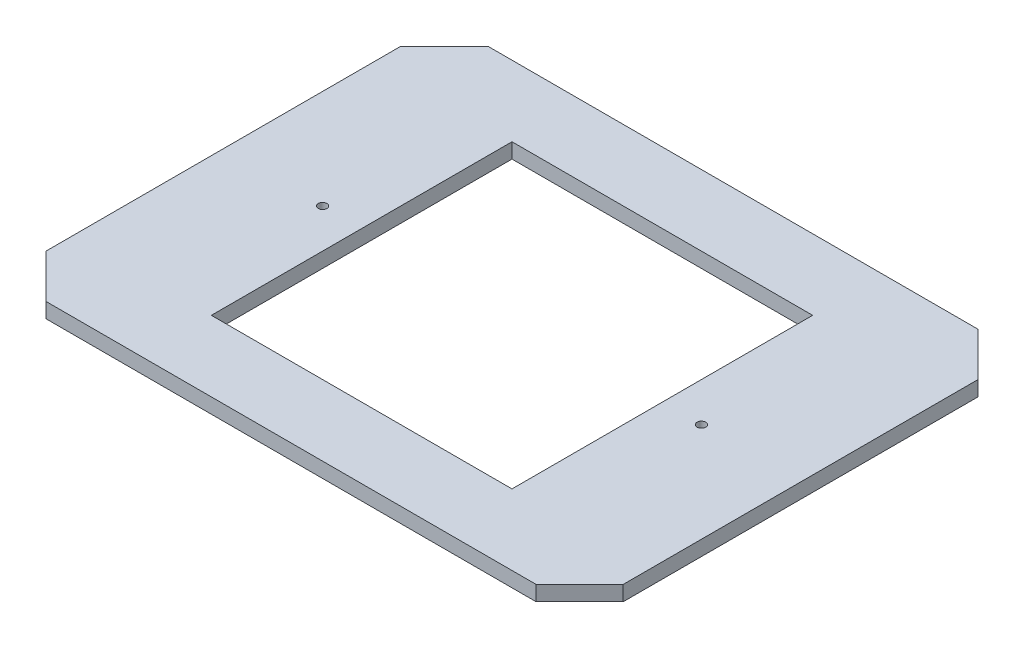
ISO-10303-21;
HEADER;
FILE_DESCRIPTION(('STEP AP214'),'2;1');
FILE_NAME('part.step','',(''),(''),'','','');
FILE_SCHEMA(('AUTOMOTIVE_DESIGN { 1 0 10303 214 1 1 1 1 }'));
ENDSEC;
DATA;
#1=APPLICATION_CONTEXT('core data for automotive mechanical design processes');
#2=APPLICATION_PROTOCOL_DEFINITION('international standard','automotive_design',2000,#1);
#3=PRODUCT_CONTEXT('',#1,'mechanical');
#4=PRODUCT('Part','Part','',(#3));
#5=PRODUCT_RELATED_PRODUCT_CATEGORY('part','',(#4));
#6=PRODUCT_DEFINITION_FORMATION('','',#4);
#7=PRODUCT_DEFINITION_CONTEXT('part definition',#1,'design');
#8=PRODUCT_DEFINITION('design','',#6,#7);
#9=PRODUCT_DEFINITION_SHAPE('','',#8);
#10=(LENGTH_UNIT() NAMED_UNIT(*) SI_UNIT(.MILLI.,.METRE.));
#11=(NAMED_UNIT(*) PLANE_ANGLE_UNIT() SI_UNIT($,.RADIAN.));
#12=(NAMED_UNIT(*) SI_UNIT($,.STERADIAN.) SOLID_ANGLE_UNIT());
#13=UNCERTAINTY_MEASURE_WITH_UNIT(LENGTH_MEASURE(1.E-05),#10,'distance_accuracy_value','');
#14=(GEOMETRIC_REPRESENTATION_CONTEXT(3) GLOBAL_UNCERTAINTY_ASSIGNED_CONTEXT((#13)) GLOBAL_UNIT_ASSIGNED_CONTEXT((#10,
#11,#12)) REPRESENTATION_CONTEXT('',''));
#15=CARTESIAN_POINT('',(0.,0.,0.));
#16=DIRECTION('',(0.,0.,1.));
#17=DIRECTION('',(1.,0.,0.));
#18=AXIS2_PLACEMENT_3D('',#15,#16,#17);
#19=CARTESIAN_POINT('',(0.,5.,0.));
#20=DIRECTION('',(0.,-1.,0.));
#21=DIRECTION('',(0.,0.,-1.));
#22=AXIS2_PLACEMENT_3D('',#19,#20,#21);
#23=PLANE('',#22);
#24=DIRECTION('',(1.,0.,0.));
#25=VECTOR('',#24,1.);
#26=CARTESIAN_POINT('',(163.,5.,0.));
#27=LINE('',#26,#25);
#28=CARTESIAN_POINT('',(0.,5.,0.));
#29=VERTEX_POINT('',#28);
#30=CARTESIAN_POINT('',(163.,5.,0.));
#31=VERTEX_POINT('',#30);
#32=EDGE_CURVE('E161',#29,#31,#27,.T.);
#33=ORIENTED_EDGE('',*,*,#32,.T.);
#34=DIRECTION('',(0.707106781186546,0.,-0.707106781186549));
#35=VECTOR('',#34,1.);
#36=CARTESIAN_POINT('',(177.5,5.,-14.5));
#37=LINE('',#36,#35);
#38=CARTESIAN_POINT('',(177.5,5.,-14.5));
#39=VERTEX_POINT('',#38);
#40=EDGE_CURVE('E164',#31,#39,#37,.T.);
#41=ORIENTED_EDGE('',*,*,#40,.T.);
#42=DIRECTION('',(0.,0.,-1.));
#43=VECTOR('',#42,1.);
#44=CARTESIAN_POINT('',(177.5,5.,-132.5));
#45=LINE('',#44,#43);
#46=CARTESIAN_POINT('',(177.5,5.,-132.5));
#47=VERTEX_POINT('',#46);
#48=EDGE_CURVE('E167',#39,#47,#45,.T.);
#49=ORIENTED_EDGE('',*,*,#48,.T.);
#50=DIRECTION('',(-0.70710678118655,0.,-0.707106781186545));
#51=VECTOR('',#50,1.);
#52=CARTESIAN_POINT('',(163.,5.,-147.));
#53=LINE('',#52,#51);
#54=CARTESIAN_POINT('',(163.,5.,-147.));
#55=VERTEX_POINT('',#54);
#56=EDGE_CURVE('E169',#47,#55,#53,.T.);
#57=ORIENTED_EDGE('',*,*,#56,.T.);
#58=DIRECTION('',(-1.,0.,0.));
#59=VECTOR('',#58,1.);
#60=CARTESIAN_POINT('',(0.,5.,-147.));
#61=LINE('',#60,#59);
#62=CARTESIAN_POINT('',(0.,5.,-147.));
#63=VERTEX_POINT('',#62);
#64=EDGE_CURVE('E171',#55,#63,#61,.T.);
#65=ORIENTED_EDGE('',*,*,#64,.T.);
#66=DIRECTION('',(-0.707106781186548,0.,0.707106781186547));
#67=VECTOR('',#66,1.);
#68=CARTESIAN_POINT('',(-14.5,5.,-132.5));
#69=LINE('',#68,#67);
#70=CARTESIAN_POINT('',(-14.5,5.,-132.5));
#71=VERTEX_POINT('',#70);
#72=EDGE_CURVE('E173',#63,#71,#69,.T.);
#73=ORIENTED_EDGE('',*,*,#72,.T.);
#74=DIRECTION('',(0.,0.,1.));
#75=VECTOR('',#74,1.);
#76=CARTESIAN_POINT('',(-14.5,5.,-14.5));
#77=LINE('',#76,#75);
#78=CARTESIAN_POINT('',(-14.5,5.,-14.5));
#79=VERTEX_POINT('',#78);
#80=EDGE_CURVE('E175',#71,#79,#77,.T.);
#81=ORIENTED_EDGE('',*,*,#80,.T.);
#82=DIRECTION('',(0.707106781186548,0.,0.707106781186548));
#83=VECTOR('',#82,1.);
#84=CARTESIAN_POINT('',(0.,5.,0.));
#85=LINE('',#84,#83);
#86=EDGE_CURVE('E177',#79,#29,#85,.T.);
#87=ORIENTED_EDGE('',*,*,#86,.T.);
#88=EDGE_LOOP('',(#33,#41,#49,#57,#65,#73,#81,#87));
#89=FACE_BOUND('',#88,.T.);
#90=DIRECTION('',(0.,0.,-1.));
#91=VECTOR('',#90,1.);
#92=CARTESIAN_POINT('',(131.5,5.,-23.5));
#93=LINE('',#92,#91);
#94=CARTESIAN_POINT('',(131.5,5.,-23.5));
#95=VERTEX_POINT('',#94);
#96=CARTESIAN_POINT('',(131.5,5.,-123.5));
#97=VERTEX_POINT('',#96);
#98=EDGE_CURVE('E122',#95,#97,#93,.T.);
#99=ORIENTED_EDGE('',*,*,#98,.F.);
#100=DIRECTION('',(1.,0.,0.));
#101=VECTOR('',#100,1.);
#102=CARTESIAN_POINT('',(31.5,5.,-23.5));
#103=LINE('',#102,#101);
#104=CARTESIAN_POINT('',(31.5,5.,-23.5));
#105=VERTEX_POINT('',#104);
#106=EDGE_CURVE('E145',#105,#95,#103,.T.);
#107=ORIENTED_EDGE('',*,*,#106,.F.);
#108=DIRECTION('',(0.,0.,1.));
#109=VECTOR('',#108,1.);
#110=CARTESIAN_POINT('',(31.5,5.,-23.5));
#111=LINE('',#110,#109);
#112=CARTESIAN_POINT('',(31.5,5.,-123.5));
#113=VERTEX_POINT('',#112);
#114=EDGE_CURVE('E143',#113,#105,#111,.T.);
#115=ORIENTED_EDGE('',*,*,#114,.F.);
#116=DIRECTION('',(-1.,0.,0.));
#117=VECTOR('',#116,1.);
#118=CARTESIAN_POINT('',(31.5,5.,-123.5));
#119=LINE('',#118,#117);
#120=EDGE_CURVE('E130',#97,#113,#119,.T.);
#121=ORIENTED_EDGE('',*,*,#120,.F.);
#122=EDGE_LOOP('',(#99,#107,#115,#121));
#123=FACE_BOUND('',#122,.T.);
#124=CARTESIAN_POINT('',(18.5,5.,-73.5));
#125=DIRECTION('',(0.,1.,0.));
#126=DIRECTION('',(0.,0.,1.));
#127=AXIS2_PLACEMENT_3D('',#124,#125,#126);
#128=CIRCLE('',#127,1.45000000000001);
#129=CARTESIAN_POINT('',(18.5,5.,-72.05));
#130=VERTEX_POINT('',#129);
#131=EDGE_CURVE('E151',#130,#130,#128,.T.);
#132=ORIENTED_EDGE('',*,*,#131,.F.);
#133=EDGE_LOOP('',(#132));
#134=FACE_BOUND('',#133,.T.);
#135=CARTESIAN_POINT('',(144.5,5.,-73.5));
#136=DIRECTION('',(0.,1.,0.));
#137=DIRECTION('',(0.,0.,1.));
#138=AXIS2_PLACEMENT_3D('',#135,#136,#137);
#139=CIRCLE('',#138,1.45);
#140=CARTESIAN_POINT('',(144.5,5.,-72.05));
#141=VERTEX_POINT('',#140);
#142=EDGE_CURVE('E300',#141,#141,#139,.T.);
#143=ORIENTED_EDGE('',*,*,#142,.F.);
#144=EDGE_LOOP('',(#143));
#145=FACE_BOUND('',#144,.T.);
#146=ADVANCED_FACE('F33',(#89,#123,#134,#145),#23,.F.);
#147=CARTESIAN_POINT('',(0.,0.,0.));
#148=DIRECTION('',(0.,-1.,0.));
#149=DIRECTION('',(0.,0.,-1.));
#150=AXIS2_PLACEMENT_3D('',#147,#148,#149);
#151=PLANE('',#150);
#152=CARTESIAN_POINT('',(18.5,0.,-73.5));
#153=DIRECTION('',(0.,1.,0.));
#154=DIRECTION('',(0.,0.,1.));
#155=AXIS2_PLACEMENT_3D('',#152,#153,#154);
#156=CIRCLE('',#155,1.45000000000001);
#157=CARTESIAN_POINT('',(18.5,0.,-72.05));
#158=VERTEX_POINT('',#157);
#159=EDGE_CURVE('E306',#158,#158,#156,.T.);
#160=ORIENTED_EDGE('',*,*,#159,.T.);
#161=EDGE_LOOP('',(#160));
#162=FACE_BOUND('',#161,.T.);
#163=DIRECTION('',(1.,0.,0.));
#164=VECTOR('',#163,1.);
#165=CARTESIAN_POINT('',(163.,0.,0.));
#166=LINE('',#165,#164);
#167=CARTESIAN_POINT('',(0.,0.,0.));
#168=VERTEX_POINT('',#167);
#169=CARTESIAN_POINT('',(163.,0.,0.));
#170=VERTEX_POINT('',#169);
#171=EDGE_CURVE('E138',#168,#170,#166,.T.);
#172=ORIENTED_EDGE('',*,*,#171,.F.);
#173=DIRECTION('',(0.707106781186548,0.,0.707106781186548));
#174=VECTOR('',#173,1.);
#175=CARTESIAN_POINT('',(0.,0.,0.));
#176=LINE('',#175,#174);
#177=CARTESIAN_POINT('',(-14.5,0.,-14.5));
#178=VERTEX_POINT('',#177);
#179=EDGE_CURVE('E165',#178,#168,#176,.T.);
#180=ORIENTED_EDGE('',*,*,#179,.F.);
#181=DIRECTION('',(0.,0.,1.));
#182=VECTOR('',#181,1.);
#183=CARTESIAN_POINT('',(-14.5,0.,-14.5));
#184=LINE('',#183,#182);
#185=CARTESIAN_POINT('',(-14.5,0.,-132.5));
#186=VERTEX_POINT('',#185);
#187=EDGE_CURVE('E192',#186,#178,#184,.T.);
#188=ORIENTED_EDGE('',*,*,#187,.F.);
#189=DIRECTION('',(-0.707106781186548,0.,0.707106781186547));
#190=VECTOR('',#189,1.);
#191=CARTESIAN_POINT('',(-14.5,0.,-132.5));
#192=LINE('',#191,#190);
#193=CARTESIAN_POINT('',(0.,0.,-147.));
#194=VERTEX_POINT('',#193);
#195=EDGE_CURVE('E190',#194,#186,#192,.T.);
#196=ORIENTED_EDGE('',*,*,#195,.F.);
#197=DIRECTION('',(-1.,0.,0.));
#198=VECTOR('',#197,1.);
#199=CARTESIAN_POINT('',(0.,0.,-147.));
#200=LINE('',#199,#198);
#201=CARTESIAN_POINT('',(163.,0.,-147.));
#202=VERTEX_POINT('',#201);
#203=EDGE_CURVE('E188',#202,#194,#200,.T.);
#204=ORIENTED_EDGE('',*,*,#203,.F.);
#205=DIRECTION('',(-0.70710678118655,0.,-0.707106781186545));
#206=VECTOR('',#205,1.);
#207=CARTESIAN_POINT('',(163.,0.,-147.));
#208=LINE('',#207,#206);
#209=CARTESIAN_POINT('',(177.5,0.,-132.5));
#210=VERTEX_POINT('',#209);
#211=EDGE_CURVE('E186',#210,#202,#208,.T.);
#212=ORIENTED_EDGE('',*,*,#211,.F.);
#213=DIRECTION('',(0.,0.,-1.));
#214=VECTOR('',#213,1.);
#215=CARTESIAN_POINT('',(177.5,0.,-132.5));
#216=LINE('',#215,#214);
#217=CARTESIAN_POINT('',(177.5,0.,-14.5));
#218=VERTEX_POINT('',#217);
#219=EDGE_CURVE('E184',#218,#210,#216,.T.);
#220=ORIENTED_EDGE('',*,*,#219,.F.);
#221=DIRECTION('',(0.707106781186546,0.,-0.707106781186549));
#222=VECTOR('',#221,1.);
#223=CARTESIAN_POINT('',(177.5,0.,-14.5));
#224=LINE('',#223,#222);
#225=EDGE_CURVE('E182',#170,#218,#224,.T.);
#226=ORIENTED_EDGE('',*,*,#225,.F.);
#227=EDGE_LOOP('',(#172,#180,#188,#196,#204,#212,#220,#226));
#228=FACE_BOUND('',#227,.T.);
#229=DIRECTION('',(1.,0.,0.));
#230=VECTOR('',#229,1.);
#231=CARTESIAN_POINT('',(31.5,0.,-23.5));
#232=LINE('',#231,#230);
#233=CARTESIAN_POINT('',(31.5,0.,-23.5));
#234=VERTEX_POINT('',#233);
#235=CARTESIAN_POINT('',(131.5,0.,-23.5));
#236=VERTEX_POINT('',#235);
#237=EDGE_CURVE('E131',#234,#236,#232,.T.);
#238=ORIENTED_EDGE('',*,*,#237,.T.);
#239=DIRECTION('',(0.,0.,-1.));
#240=VECTOR('',#239,1.);
#241=CARTESIAN_POINT('',(131.5,0.,-23.5));
#242=LINE('',#241,#240);
#243=CARTESIAN_POINT('',(131.5,0.,-123.5));
#244=VERTEX_POINT('',#243);
#245=EDGE_CURVE('E56',#236,#244,#242,.T.);
#246=ORIENTED_EDGE('',*,*,#245,.T.);
#247=DIRECTION('',(-1.,0.,0.));
#248=VECTOR('',#247,1.);
#249=CARTESIAN_POINT('',(31.5,0.,-123.5));
#250=LINE('',#249,#248);
#251=CARTESIAN_POINT('',(31.5,0.,-123.5));
#252=VERTEX_POINT('',#251);
#253=EDGE_CURVE('E137',#244,#252,#250,.T.);
#254=ORIENTED_EDGE('',*,*,#253,.T.);
#255=DIRECTION('',(0.,0.,1.));
#256=VECTOR('',#255,1.);
#257=CARTESIAN_POINT('',(31.5,0.,-23.5));
#258=LINE('',#257,#256);
#259=EDGE_CURVE('E153',#252,#234,#258,.T.);
#260=ORIENTED_EDGE('',*,*,#259,.T.);
#261=EDGE_LOOP('',(#238,#246,#254,#260));
#262=FACE_BOUND('',#261,.T.);
#263=CARTESIAN_POINT('',(144.5,0.,-73.5));
#264=DIRECTION('',(0.,1.,0.));
#265=DIRECTION('',(0.,0.,1.));
#266=AXIS2_PLACEMENT_3D('',#263,#264,#265);
#267=CIRCLE('',#266,1.45);
#268=CARTESIAN_POINT('',(144.5,0.,-72.05));
#269=VERTEX_POINT('',#268);
#270=EDGE_CURVE('E303',#269,#269,#267,.T.);
#271=ORIENTED_EDGE('',*,*,#270,.T.);
#272=EDGE_LOOP('',(#271));
#273=FACE_BOUND('',#272,.T.);
#274=ADVANCED_FACE('F222',(#162,#228,#262,#273),#151,.T.);
#275=CARTESIAN_POINT('',(163.,5.,0.));
#276=DIRECTION('',(0.,0.,-1.));
#277=DIRECTION('',(-1.,0.,0.));
#278=AXIS2_PLACEMENT_3D('',#275,#276,#277);
#279=PLANE('',#278);
#280=ORIENTED_EDGE('',*,*,#171,.T.);
#281=DIRECTION('',(0.,-1.,0.));
#282=VECTOR('',#281,1.);
#283=CARTESIAN_POINT('',(163.,5.,0.));
#284=LINE('',#283,#282);
#285=EDGE_CURVE('E11',#31,#170,#284,.T.);
#286=ORIENTED_EDGE('',*,*,#285,.F.);
#287=ORIENTED_EDGE('',*,*,#32,.F.);
#288=DIRECTION('',(0.,-1.,0.));
#289=VECTOR('',#288,1.);
#290=CARTESIAN_POINT('',(0.,5.,0.));
#291=LINE('',#290,#289);
#292=EDGE_CURVE('E179',#29,#168,#291,.T.);
#293=ORIENTED_EDGE('',*,*,#292,.T.);
#294=EDGE_LOOP('',(#280,#286,#287,#293));
#295=FACE_BOUND('',#294,.T.);
#296=ADVANCED_FACE('F35',(#295),#279,.F.);
#297=CARTESIAN_POINT('',(177.5,5.,-14.5));
#298=DIRECTION('',(-0.707106781186549,0.,-0.707106781186546));
#299=DIRECTION('',(-0.707106781186546,0.,0.707106781186549));
#300=AXIS2_PLACEMENT_3D('',#297,#298,#299);
#301=PLANE('',#300);
#302=ORIENTED_EDGE('',*,*,#225,.T.);
#303=DIRECTION('',(0.,-1.,0.));
#304=VECTOR('',#303,1.);
#305=CARTESIAN_POINT('',(177.5,5.,-14.5));
#306=LINE('',#305,#304);
#307=EDGE_CURVE('E41',#39,#218,#306,.T.);
#308=ORIENTED_EDGE('',*,*,#307,.F.);
#309=ORIENTED_EDGE('',*,*,#40,.F.);
#310=ORIENTED_EDGE('',*,*,#285,.T.);
#311=EDGE_LOOP('',(#302,#308,#309,#310));
#312=FACE_BOUND('',#311,.T.);
#313=ADVANCED_FACE('F239',(#312),#301,.F.);
#314=CARTESIAN_POINT('',(177.5,5.,-132.5));
#315=DIRECTION('',(-1.,0.,0.));
#316=DIRECTION('',(0.,0.,1.));
#317=AXIS2_PLACEMENT_3D('',#314,#315,#316);
#318=PLANE('',#317);
#319=ORIENTED_EDGE('',*,*,#219,.T.);
#320=DIRECTION('',(0.,-1.,0.));
#321=VECTOR('',#320,1.);
#322=CARTESIAN_POINT('',(177.5,5.,-132.5));
#323=LINE('',#322,#321);
#324=EDGE_CURVE('E209',#47,#210,#323,.T.);
#325=ORIENTED_EDGE('',*,*,#324,.F.);
#326=ORIENTED_EDGE('',*,*,#48,.F.);
#327=ORIENTED_EDGE('',*,*,#307,.T.);
#328=EDGE_LOOP('',(#319,#325,#326,#327));
#329=FACE_BOUND('',#328,.T.);
#330=ADVANCED_FACE('F216',(#329),#318,.F.);
#331=CARTESIAN_POINT('',(163.,5.,-147.));
#332=DIRECTION('',(-0.707106781186545,0.,0.70710678118655));
#333=DIRECTION('',(0.70710678118655,0.,0.707106781186545));
#334=AXIS2_PLACEMENT_3D('',#331,#332,#333);
#335=PLANE('',#334);
#336=ORIENTED_EDGE('',*,*,#211,.T.);
#337=DIRECTION('',(0.,-1.,0.));
#338=VECTOR('',#337,1.);
#339=CARTESIAN_POINT('',(163.,5.,-147.));
#340=LINE('',#339,#338);
#341=EDGE_CURVE('E206',#55,#202,#340,.T.);
#342=ORIENTED_EDGE('',*,*,#341,.F.);
#343=ORIENTED_EDGE('',*,*,#56,.F.);
#344=ORIENTED_EDGE('',*,*,#324,.T.);
#345=EDGE_LOOP('',(#336,#342,#343,#344));
#346=FACE_BOUND('',#345,.T.);
#347=ADVANCED_FACE('F228',(#346),#335,.F.);
#348=CARTESIAN_POINT('',(0.,5.,-147.));
#349=DIRECTION('',(0.,0.,1.));
#350=DIRECTION('',(1.,0.,0.));
#351=AXIS2_PLACEMENT_3D('',#348,#349,#350);
#352=PLANE('',#351);
#353=ORIENTED_EDGE('',*,*,#203,.T.);
#354=DIRECTION('',(0.,-1.,0.));
#355=VECTOR('',#354,1.);
#356=CARTESIAN_POINT('',(0.,5.,-147.));
#357=LINE('',#356,#355);
#358=EDGE_CURVE('E203',#63,#194,#357,.T.);
#359=ORIENTED_EDGE('',*,*,#358,.F.);
#360=ORIENTED_EDGE('',*,*,#64,.F.);
#361=ORIENTED_EDGE('',*,*,#341,.T.);
#362=EDGE_LOOP('',(#353,#359,#360,#361));
#363=FACE_BOUND('',#362,.T.);
#364=ADVANCED_FACE('F232',(#363),#352,.F.);
#365=CARTESIAN_POINT('',(-14.5,5.,-132.5));
#366=DIRECTION('',(0.707106781186547,0.,0.707106781186548));
#367=DIRECTION('',(0.707106781186548,0.,-0.707106781186547));
#368=AXIS2_PLACEMENT_3D('',#365,#366,#367);
#369=PLANE('',#368);
#370=ORIENTED_EDGE('',*,*,#195,.T.);
#371=DIRECTION('',(0.,-1.,0.));
#372=VECTOR('',#371,1.);
#373=CARTESIAN_POINT('',(-14.5,5.,-132.5));
#374=LINE('',#373,#372);
#375=EDGE_CURVE('E200',#71,#186,#374,.T.);
#376=ORIENTED_EDGE('',*,*,#375,.F.);
#377=ORIENTED_EDGE('',*,*,#72,.F.);
#378=ORIENTED_EDGE('',*,*,#358,.T.);
#379=EDGE_LOOP('',(#370,#376,#377,#378));
#380=FACE_BOUND('',#379,.T.);
#381=ADVANCED_FACE('F252',(#380),#369,.F.);
#382=CARTESIAN_POINT('',(-14.5,5.,-14.5));
#383=DIRECTION('',(1.,0.,0.));
#384=DIRECTION('',(0.,0.,-1.));
#385=AXIS2_PLACEMENT_3D('',#382,#383,#384);
#386=PLANE('',#385);
#387=ORIENTED_EDGE('',*,*,#187,.T.);
#388=DIRECTION('',(0.,-1.,0.));
#389=VECTOR('',#388,1.);
#390=CARTESIAN_POINT('',(-14.5,5.,-14.5));
#391=LINE('',#390,#389);
#392=EDGE_CURVE('E197',#79,#178,#391,.T.);
#393=ORIENTED_EDGE('',*,*,#392,.F.);
#394=ORIENTED_EDGE('',*,*,#80,.F.);
#395=ORIENTED_EDGE('',*,*,#375,.T.);
#396=EDGE_LOOP('',(#387,#393,#394,#395));
#397=FACE_BOUND('',#396,.T.);
#398=ADVANCED_FACE('F250',(#397),#386,.F.);
#399=CARTESIAN_POINT('',(0.,5.,0.));
#400=DIRECTION('',(0.707106781186548,0.,-0.707106781186548));
#401=DIRECTION('',(-0.707106781186548,0.,-0.707106781186548));
#402=AXIS2_PLACEMENT_3D('',#399,#400,#401);
#403=PLANE('',#402);
#404=ORIENTED_EDGE('',*,*,#179,.T.);
#405=ORIENTED_EDGE('',*,*,#292,.F.);
#406=ORIENTED_EDGE('',*,*,#86,.F.);
#407=ORIENTED_EDGE('',*,*,#392,.T.);
#408=EDGE_LOOP('',(#404,#405,#406,#407));
#409=FACE_BOUND('',#408,.T.);
#410=ADVANCED_FACE('F245',(#409),#403,.F.);
#411=CARTESIAN_POINT('',(131.5,5.,-23.5));
#412=DIRECTION('',(-1.,0.,0.));
#413=DIRECTION('',(0.,0.,1.));
#414=AXIS2_PLACEMENT_3D('',#411,#412,#413);
#415=PLANE('',#414);
#416=ORIENTED_EDGE('',*,*,#245,.F.);
#417=DIRECTION('',(0.,-1.,0.));
#418=VECTOR('',#417,1.);
#419=CARTESIAN_POINT('',(131.5,5.,-23.5));
#420=LINE('',#419,#418);
#421=EDGE_CURVE('E126',#95,#236,#420,.T.);
#422=ORIENTED_EDGE('',*,*,#421,.F.);
#423=ORIENTED_EDGE('',*,*,#98,.T.);
#424=DIRECTION('',(0.,-1.,0.));
#425=VECTOR('',#424,1.);
#426=CARTESIAN_POINT('',(131.5,5.,-123.5));
#427=LINE('',#426,#425);
#428=EDGE_CURVE('E125',#97,#244,#427,.T.);
#429=ORIENTED_EDGE('',*,*,#428,.T.);
#430=EDGE_LOOP('',(#416,#422,#423,#429));
#431=FACE_BOUND('',#430,.T.);
#432=ADVANCED_FACE('F124',(#431),#415,.T.);
#433=CARTESIAN_POINT('',(31.5,5.,-123.5));
#434=DIRECTION('',(0.,0.,1.));
#435=DIRECTION('',(1.,0.,0.));
#436=AXIS2_PLACEMENT_3D('',#433,#434,#435);
#437=PLANE('',#436);
#438=ORIENTED_EDGE('',*,*,#253,.F.);
#439=ORIENTED_EDGE('',*,*,#428,.F.);
#440=ORIENTED_EDGE('',*,*,#120,.T.);
#441=DIRECTION('',(0.,-1.,0.));
#442=VECTOR('',#441,1.);
#443=CARTESIAN_POINT('',(31.5,5.,-123.5));
#444=LINE('',#443,#442);
#445=EDGE_CURVE('E139',#113,#252,#444,.T.);
#446=ORIENTED_EDGE('',*,*,#445,.T.);
#447=EDGE_LOOP('',(#438,#439,#440,#446));
#448=FACE_BOUND('',#447,.T.);
#449=ADVANCED_FACE('F134',(#448),#437,.T.);
#450=CARTESIAN_POINT('',(31.5,5.,-23.5));
#451=DIRECTION('',(1.,0.,0.));
#452=DIRECTION('',(0.,0.,-1.));
#453=AXIS2_PLACEMENT_3D('',#450,#451,#452);
#454=PLANE('',#453);
#455=ORIENTED_EDGE('',*,*,#259,.F.);
#456=ORIENTED_EDGE('',*,*,#445,.F.);
#457=ORIENTED_EDGE('',*,*,#114,.T.);
#458=DIRECTION('',(0.,-1.,0.));
#459=VECTOR('',#458,1.);
#460=CARTESIAN_POINT('',(31.5,5.,-23.5));
#461=LINE('',#460,#459);
#462=EDGE_CURVE('E48',#105,#234,#461,.T.);
#463=ORIENTED_EDGE('',*,*,#462,.T.);
#464=EDGE_LOOP('',(#455,#456,#457,#463));
#465=FACE_BOUND('',#464,.T.);
#466=ADVANCED_FACE('F278',(#465),#454,.T.);
#467=CARTESIAN_POINT('',(31.5,5.,-23.5));
#468=DIRECTION('',(0.,0.,-1.));
#469=DIRECTION('',(-1.,0.,0.));
#470=AXIS2_PLACEMENT_3D('',#467,#468,#469);
#471=PLANE('',#470);
#472=ORIENTED_EDGE('',*,*,#237,.F.);
#473=ORIENTED_EDGE('',*,*,#462,.F.);
#474=ORIENTED_EDGE('',*,*,#106,.T.);
#475=ORIENTED_EDGE('',*,*,#421,.T.);
#476=EDGE_LOOP('',(#472,#473,#474,#475));
#477=FACE_BOUND('',#476,.T.);
#478=ADVANCED_FACE('F282',(#477),#471,.T.);
#479=CARTESIAN_POINT('',(18.5,5.,-73.5));
#480=DIRECTION('',(0.,-1.,0.));
#481=DIRECTION('',(0.,0.,-1.));
#482=AXIS2_PLACEMENT_3D('',#479,#480,#481);
#483=CYLINDRICAL_SURFACE('',#482,1.45000000000001);
#484=ORIENTED_EDGE('',*,*,#131,.T.);
#485=EDGE_LOOP('',(#484));
#486=FACE_BOUND('',#485,.T.);
#487=ORIENTED_EDGE('',*,*,#159,.F.);
#488=EDGE_LOOP('',(#487));
#489=FACE_BOUND('',#488,.T.);
#490=ADVANCED_FACE('F288',(#486,#489),#483,.F.);
#491=CARTESIAN_POINT('',(144.5,5.,-73.5));
#492=DIRECTION('',(0.,-1.,0.));
#493=DIRECTION('',(0.,0.,-1.));
#494=AXIS2_PLACEMENT_3D('',#491,#492,#493);
#495=CYLINDRICAL_SURFACE('',#494,1.45);
#496=ORIENTED_EDGE('',*,*,#142,.T.);
#497=EDGE_LOOP('',(#496));
#498=FACE_BOUND('',#497,.T.);
#499=ORIENTED_EDGE('',*,*,#270,.F.);
#500=EDGE_LOOP('',(#499));
#501=FACE_BOUND('',#500,.T.);
#502=ADVANCED_FACE('F291',(#498,#501),#495,.F.);
#503=CLOSED_SHELL('',(#146,#274,#296,#313,#330,#347,#364,#381,#398,#410,#432,#449,#466,#478,
#490,#502));
#504=MANIFOLD_SOLID_BREP('B2',#503);
#505=ADVANCED_BREP_SHAPE_REPRESENTATION('',(#18,#504),#14);
#506=SHAPE_DEFINITION_REPRESENTATION(#9,#505);
ENDSEC;
END-ISO-10303-21;
